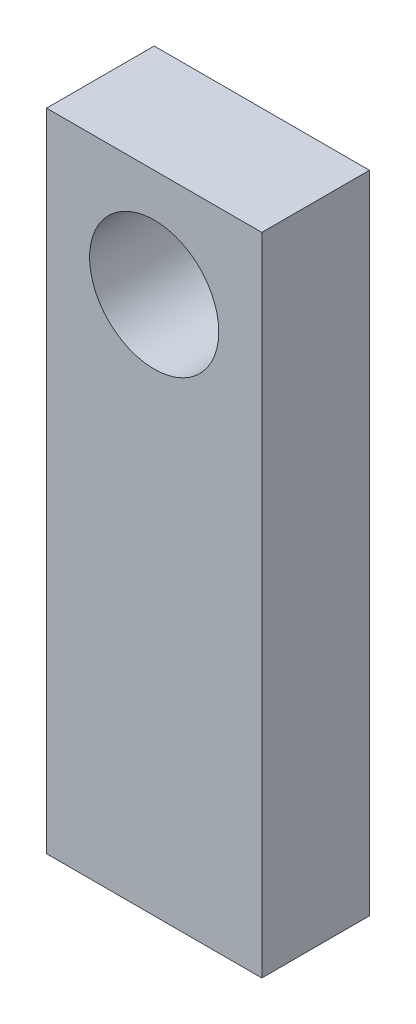
ISO-10303-21;
HEADER;
FILE_DESCRIPTION(('STEP AP214'),'2;1');
FILE_NAME('part.step','',(''),(''),'','','');
FILE_SCHEMA(('AUTOMOTIVE_DESIGN { 1 0 10303 214 1 1 1 1 }'));
ENDSEC;
DATA;
#1=APPLICATION_CONTEXT('core data for automotive mechanical design processes');
#2=APPLICATION_PROTOCOL_DEFINITION('international standard','automotive_design',2000,#1);
#3=PRODUCT_CONTEXT('',#1,'mechanical');
#4=PRODUCT('Part','Part','',(#3));
#5=PRODUCT_RELATED_PRODUCT_CATEGORY('part','',(#4));
#6=PRODUCT_DEFINITION_FORMATION('','',#4);
#7=PRODUCT_DEFINITION_CONTEXT('part definition',#1,'design');
#8=PRODUCT_DEFINITION('design','',#6,#7);
#9=PRODUCT_DEFINITION_SHAPE('','',#8);
#10=(LENGTH_UNIT() NAMED_UNIT(*) SI_UNIT(.MILLI.,.METRE.));
#11=(NAMED_UNIT(*) PLANE_ANGLE_UNIT() SI_UNIT($,.RADIAN.));
#12=(NAMED_UNIT(*) SI_UNIT($,.STERADIAN.) SOLID_ANGLE_UNIT());
#13=UNCERTAINTY_MEASURE_WITH_UNIT(LENGTH_MEASURE(1.E-05),#10,'distance_accuracy_value','');
#14=(GEOMETRIC_REPRESENTATION_CONTEXT(3) GLOBAL_UNCERTAINTY_ASSIGNED_CONTEXT((#13)) GLOBAL_UNIT_ASSIGNED_CONTEXT((#10,
#11,#12)) REPRESENTATION_CONTEXT('',''));
#15=CARTESIAN_POINT('',(0.,0.,0.));
#16=DIRECTION('',(0.,0.,1.));
#17=DIRECTION('',(1.,0.,0.));
#18=AXIS2_PLACEMENT_3D('',#15,#16,#17);
#19=CARTESIAN_POINT('',(0.,0.,6.35));
#20=DIRECTION('',(1.,0.,0.));
#21=DIRECTION('',(0.,1.,0.));
#22=AXIS2_PLACEMENT_3D('',#19,#20,#21);
#23=PLANE('',#22);
#24=DIRECTION('',(0.,-1.,0.));
#25=VECTOR('',#24,1.);
#26=CARTESIAN_POINT('',(0.,0.,0.));
#27=LINE('',#26,#25);
#28=CARTESIAN_POINT('',(0.,0.,0.));
#29=VERTEX_POINT('',#28);
#30=CARTESIAN_POINT('',(0.,-38.1,0.));
#31=VERTEX_POINT('',#30);
#32=EDGE_CURVE('E95',#29,#31,#27,.T.);
#33=ORIENTED_EDGE('',*,*,#32,.T.);
#34=DIRECTION('',(0.,0.,-1.));
#35=VECTOR('',#34,1.);
#36=CARTESIAN_POINT('',(0.,-38.1,6.35));
#37=LINE('',#36,#35);
#38=CARTESIAN_POINT('',(0.,-38.1,6.35));
#39=VERTEX_POINT('',#38);
#40=EDGE_CURVE('E11',#39,#31,#37,.T.);
#41=ORIENTED_EDGE('',*,*,#40,.F.);
#42=DIRECTION('',(0.,-1.,0.));
#43=VECTOR('',#42,1.);
#44=CARTESIAN_POINT('',(0.,0.,6.35));
#45=LINE('',#44,#43);
#46=CARTESIAN_POINT('',(0.,0.,6.35));
#47=VERTEX_POINT('',#46);
#48=EDGE_CURVE('E83',#47,#39,#45,.T.);
#49=ORIENTED_EDGE('',*,*,#48,.F.);
#50=DIRECTION('',(0.,0.,-1.));
#51=VECTOR('',#50,1.);
#52=CARTESIAN_POINT('',(0.,0.,6.35));
#53=LINE('',#52,#51);
#54=EDGE_CURVE('E91',#47,#29,#53,.T.);
#55=ORIENTED_EDGE('',*,*,#54,.T.);
#56=EDGE_LOOP('',(#33,#41,#49,#55));
#57=FACE_BOUND('',#56,.T.);
#58=ADVANCED_FACE('F32',(#57),#23,.F.);
#59=CARTESIAN_POINT('',(0.,-38.1,6.35));
#60=DIRECTION('',(0.,1.,0.));
#61=DIRECTION('',(0.,0.,1.));
#62=AXIS2_PLACEMENT_3D('',#59,#60,#61);
#63=PLANE('',#62);
#64=DIRECTION('',(1.,0.,0.));
#65=VECTOR('',#64,1.);
#66=CARTESIAN_POINT('',(0.,-38.1,0.));
#67=LINE('',#66,#65);
#68=CARTESIAN_POINT('',(12.7,-38.1,0.));
#69=VERTEX_POINT('',#68);
#70=EDGE_CURVE('E87',#31,#69,#67,.T.);
#71=ORIENTED_EDGE('',*,*,#70,.T.);
#72=DIRECTION('',(0.,0.,-1.));
#73=VECTOR('',#72,1.);
#74=CARTESIAN_POINT('',(12.7,-38.1,6.35));
#75=LINE('',#74,#73);
#76=CARTESIAN_POINT('',(12.7,-38.1,6.35));
#77=VERTEX_POINT('',#76);
#78=EDGE_CURVE('E40',#77,#69,#75,.T.);
#79=ORIENTED_EDGE('',*,*,#78,.F.);
#80=DIRECTION('',(1.,0.,0.));
#81=VECTOR('',#80,1.);
#82=CARTESIAN_POINT('',(0.,-38.1,6.35));
#83=LINE('',#82,#81);
#84=EDGE_CURVE('E78',#39,#77,#83,.T.);
#85=ORIENTED_EDGE('',*,*,#84,.F.);
#86=ORIENTED_EDGE('',*,*,#40,.T.);
#87=EDGE_LOOP('',(#71,#79,#85,#86));
#88=FACE_BOUND('',#87,.T.);
#89=ADVANCED_FACE('F86',(#88),#63,.F.);
#90=CARTESIAN_POINT('',(12.7,0.,6.35));
#91=DIRECTION('',(-1.,0.,0.));
#92=DIRECTION('',(0.,-1.,0.));
#93=AXIS2_PLACEMENT_3D('',#90,#91,#92);
#94=PLANE('',#93);
#95=DIRECTION('',(0.,1.,0.));
#96=VECTOR('',#95,1.);
#97=CARTESIAN_POINT('',(12.7,0.,0.));
#98=LINE('',#97,#96);
#99=CARTESIAN_POINT('',(12.7,0.,0.));
#100=VERTEX_POINT('',#99);
#101=EDGE_CURVE('E65',#69,#100,#98,.T.);
#102=ORIENTED_EDGE('',*,*,#101,.T.);
#103=DIRECTION('',(0.,0.,-1.));
#104=VECTOR('',#103,1.);
#105=CARTESIAN_POINT('',(12.7,0.,6.35));
#106=LINE('',#105,#104);
#107=CARTESIAN_POINT('',(12.7,0.,6.35));
#108=VERTEX_POINT('',#107);
#109=EDGE_CURVE('E88',#108,#100,#106,.T.);
#110=ORIENTED_EDGE('',*,*,#109,.F.);
#111=DIRECTION('',(0.,1.,0.));
#112=VECTOR('',#111,1.);
#113=CARTESIAN_POINT('',(12.7,0.,6.35));
#114=LINE('',#113,#112);
#115=EDGE_CURVE('E81',#77,#108,#114,.T.);
#116=ORIENTED_EDGE('',*,*,#115,.F.);
#117=ORIENTED_EDGE('',*,*,#78,.T.);
#118=EDGE_LOOP('',(#102,#110,#116,#117));
#119=FACE_BOUND('',#118,.T.);
#120=ADVANCED_FACE('F89',(#119),#94,.F.);
#121=CARTESIAN_POINT('',(0.,0.,6.35));
#122=DIRECTION('',(0.,-1.,0.));
#123=DIRECTION('',(0.,0.,-1.));
#124=AXIS2_PLACEMENT_3D('',#121,#122,#123);
#125=PLANE('',#124);
#126=DIRECTION('',(-1.,0.,0.));
#127=VECTOR('',#126,1.);
#128=CARTESIAN_POINT('',(0.,0.,0.));
#129=LINE('',#128,#127);
#130=EDGE_CURVE('E71',#100,#29,#129,.T.);
#131=ORIENTED_EDGE('',*,*,#130,.T.);
#132=ORIENTED_EDGE('',*,*,#54,.F.);
#133=DIRECTION('',(-1.,0.,0.));
#134=VECTOR('',#133,1.);
#135=CARTESIAN_POINT('',(0.,0.,6.35));
#136=LINE('',#135,#134);
#137=EDGE_CURVE('E48',#108,#47,#136,.T.);
#138=ORIENTED_EDGE('',*,*,#137,.F.);
#139=ORIENTED_EDGE('',*,*,#109,.T.);
#140=EDGE_LOOP('',(#131,#132,#138,#139));
#141=FACE_BOUND('',#140,.T.);
#142=ADVANCED_FACE('F103',(#141),#125,.F.);
#143=CARTESIAN_POINT('',(0.,0.,6.35));
#144=DIRECTION('',(0.,0.,1.));
#145=DIRECTION('',(1.,0.,0.));
#146=AXIS2_PLACEMENT_3D('',#143,#144,#145);
#147=PLANE('',#146);
#148=CARTESIAN_POINT('',(6.35,-6.35,6.35));
#149=DIRECTION('',(0.,0.,1.));
#150=DIRECTION('',(1.,0.,0.));
#151=AXIS2_PLACEMENT_3D('',#148,#149,#150);
#152=CIRCLE('',#151,3.81);
#153=CARTESIAN_POINT('',(10.16,-6.35,6.35));
#154=VERTEX_POINT('',#153);
#155=EDGE_CURVE('E98',#154,#154,#152,.T.);
#156=ORIENTED_EDGE('',*,*,#155,.F.);
#157=EDGE_LOOP('',(#156));
#158=FACE_BOUND('',#157,.T.);
#159=ORIENTED_EDGE('',*,*,#48,.T.);
#160=ORIENTED_EDGE('',*,*,#84,.T.);
#161=ORIENTED_EDGE('',*,*,#115,.T.);
#162=ORIENTED_EDGE('',*,*,#137,.T.);
#163=EDGE_LOOP('',(#159,#160,#161,#162));
#164=FACE_BOUND('',#163,.T.);
#165=ADVANCED_FACE('F79',(#158,#164),#147,.T.);
#166=CARTESIAN_POINT('',(0.,0.,0.));
#167=DIRECTION('',(0.,0.,1.));
#168=DIRECTION('',(1.,0.,0.));
#169=AXIS2_PLACEMENT_3D('',#166,#167,#168);
#170=PLANE('',#169);
#171=CARTESIAN_POINT('',(6.35,-6.35,0.));
#172=DIRECTION('',(0.,0.,1.));
#173=DIRECTION('',(1.,0.,0.));
#174=AXIS2_PLACEMENT_3D('',#171,#172,#173);
#175=CIRCLE('',#174,3.81);
#176=CARTESIAN_POINT('',(10.16,-6.35,0.));
#177=VERTEX_POINT('',#176);
#178=EDGE_CURVE('E111',#177,#177,#175,.T.);
#179=ORIENTED_EDGE('',*,*,#178,.T.);
#180=EDGE_LOOP('',(#179));
#181=FACE_BOUND('',#180,.T.);
#182=ORIENTED_EDGE('',*,*,#32,.F.);
#183=ORIENTED_EDGE('',*,*,#130,.F.);
#184=ORIENTED_EDGE('',*,*,#101,.F.);
#185=ORIENTED_EDGE('',*,*,#70,.F.);
#186=EDGE_LOOP('',(#182,#183,#184,#185));
#187=FACE_BOUND('',#186,.T.);
#188=ADVANCED_FACE('F106',(#181,#187),#170,.F.);
#189=CARTESIAN_POINT('',(6.35,-6.35,0.));
#190=DIRECTION('',(0.,0.,1.));
#191=DIRECTION('',(1.,0.,0.));
#192=AXIS2_PLACEMENT_3D('',#189,#190,#191);
#193=CYLINDRICAL_SURFACE('',#192,3.81);
#194=ORIENTED_EDGE('',*,*,#155,.T.);
#195=EDGE_LOOP('',(#194));
#196=FACE_BOUND('',#195,.T.);
#197=ORIENTED_EDGE('',*,*,#178,.F.);
#198=EDGE_LOOP('',(#197));
#199=FACE_BOUND('',#198,.T.);
#200=ADVANCED_FACE('F116',(#196,#199),#193,.F.);
#201=CLOSED_SHELL('',(#58,#89,#120,#142,#165,#188,#200));
#202=MANIFOLD_SOLID_BREP('B2',#201);
#203=ADVANCED_BREP_SHAPE_REPRESENTATION('',(#18,#202),#14);
#204=SHAPE_DEFINITION_REPRESENTATION(#9,#203);
ENDSEC;
END-ISO-10303-21;
